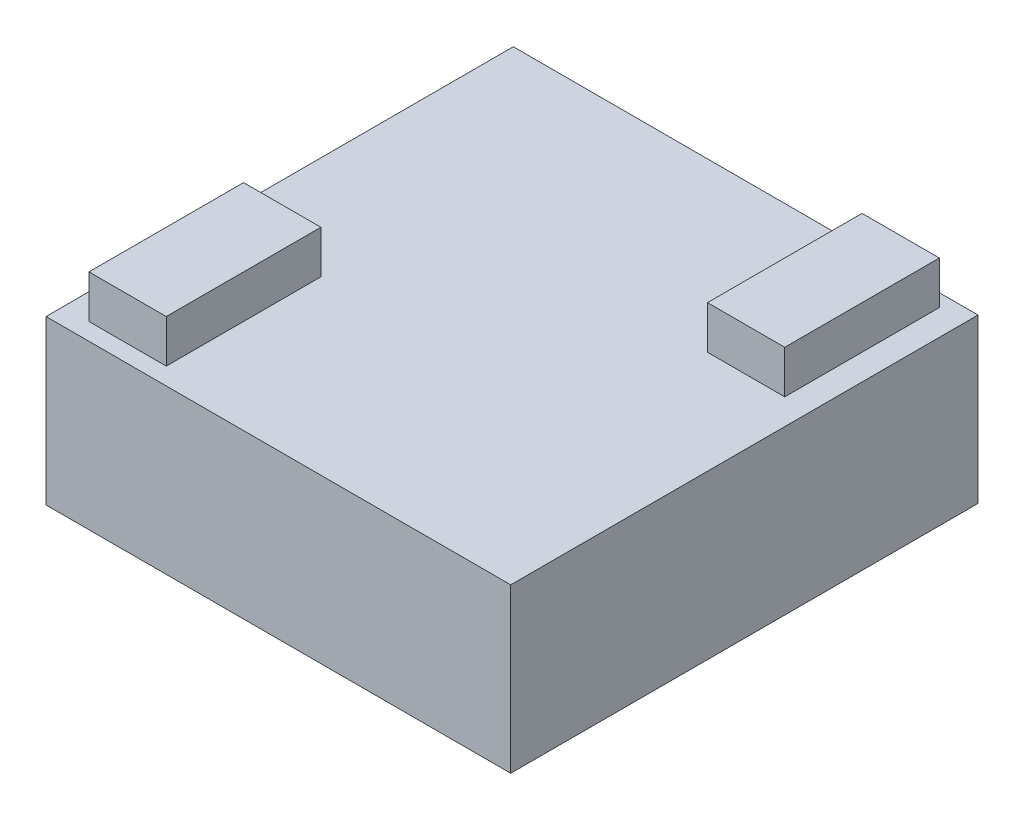
ISO-10303-21;
HEADER;
FILE_DESCRIPTION(('STEP AP214'),'2;1');
FILE_NAME('part.step','',(''),(''),'','','');
FILE_SCHEMA(('AUTOMOTIVE_DESIGN { 1 0 10303 214 1 1 1 1 }'));
ENDSEC;
DATA;
#1=APPLICATION_CONTEXT('core data for automotive mechanical design processes');
#2=APPLICATION_PROTOCOL_DEFINITION('international standard','automotive_design',2000,#1);
#3=PRODUCT_CONTEXT('',#1,'mechanical');
#4=PRODUCT('Part','Part','',(#3));
#5=PRODUCT_RELATED_PRODUCT_CATEGORY('part','',(#4));
#6=PRODUCT_DEFINITION_FORMATION('','',#4);
#7=PRODUCT_DEFINITION_CONTEXT('part definition',#1,'design');
#8=PRODUCT_DEFINITION('design','',#6,#7);
#9=PRODUCT_DEFINITION_SHAPE('','',#8);
#10=(LENGTH_UNIT() NAMED_UNIT(*) SI_UNIT(.MILLI.,.METRE.));
#11=(NAMED_UNIT(*) PLANE_ANGLE_UNIT() SI_UNIT($,.RADIAN.));
#12=(NAMED_UNIT(*) SI_UNIT($,.STERADIAN.) SOLID_ANGLE_UNIT());
#13=UNCERTAINTY_MEASURE_WITH_UNIT(LENGTH_MEASURE(1.E-05),#10,'distance_accuracy_value','');
#14=(GEOMETRIC_REPRESENTATION_CONTEXT(3) GLOBAL_UNCERTAINTY_ASSIGNED_CONTEXT((#13)) GLOBAL_UNIT_ASSIGNED_CONTEXT((#10,
#11,#12)) REPRESENTATION_CONTEXT('',''));
#15=CARTESIAN_POINT('',(0.,0.,0.));
#16=DIRECTION('',(0.,0.,1.));
#17=DIRECTION('',(1.,0.,0.));
#18=AXIS2_PLACEMENT_3D('',#15,#16,#17);
#19=CARTESIAN_POINT('',(0.,19.,0.));
#20=DIRECTION('',(0.,-1.,0.));
#21=DIRECTION('',(0.,0.,-1.));
#22=AXIS2_PLACEMENT_3D('',#19,#20,#21);
#23=PLANE('',#22);
#24=DIRECTION('',(0.,0.,1.));
#25=VECTOR('',#24,1.);
#26=CARTESIAN_POINT('',(42.1,19.,-52.9));
#27=LINE('',#26,#25);
#28=CARTESIAN_POINT('',(42.1,19.,-52.9));
#29=VERTEX_POINT('',#28);
#30=CARTESIAN_POINT('',(42.1,19.,-34.9));
#31=VERTEX_POINT('',#30);
#32=EDGE_CURVE('E168',#29,#31,#27,.T.);
#33=ORIENTED_EDGE('',*,*,#32,.F.);
#34=DIRECTION('',(-1.,0.,0.));
#35=VECTOR('',#34,1.);
#36=CARTESIAN_POINT('',(42.1,19.,-52.9));
#37=LINE('',#36,#35);
#38=CARTESIAN_POINT('',(51.1,19.,-52.9));
#39=VERTEX_POINT('',#38);
#40=EDGE_CURVE('E181',#39,#29,#37,.T.);
#41=ORIENTED_EDGE('',*,*,#40,.F.);
#42=DIRECTION('',(0.,0.,-1.));
#43=VECTOR('',#42,1.);
#44=CARTESIAN_POINT('',(51.1,19.,-52.9));
#45=LINE('',#44,#43);
#46=CARTESIAN_POINT('',(51.1,19.,-34.9));
#47=VERTEX_POINT('',#46);
#48=EDGE_CURVE('E190',#47,#39,#45,.T.);
#49=ORIENTED_EDGE('',*,*,#48,.F.);
#50=DIRECTION('',(1.,0.,0.));
#51=VECTOR('',#50,1.);
#52=CARTESIAN_POINT('',(42.1,19.,-34.9));
#53=LINE('',#52,#51);
#54=EDGE_CURVE('E171',#31,#47,#53,.T.);
#55=ORIENTED_EDGE('',*,*,#54,.F.);
#56=EDGE_LOOP('',(#33,#41,#49,#55));
#57=FACE_BOUND('',#56,.T.);
#58=DIRECTION('',(0.,0.,1.));
#59=VECTOR('',#58,1.);
#60=CARTESIAN_POINT('',(0.,19.,0.));
#61=LINE('',#60,#59);
#62=CARTESIAN_POINT('',(0.,19.,-54.4));
#63=VERTEX_POINT('',#62);
#64=CARTESIAN_POINT('',(0.,19.,0.));
#65=VERTEX_POINT('',#64);
#66=EDGE_CURVE('E236',#63,#65,#61,.T.);
#67=ORIENTED_EDGE('',*,*,#66,.T.);
#68=DIRECTION('',(1.,0.,0.));
#69=VECTOR('',#68,1.);
#70=CARTESIAN_POINT('',(0.,19.,0.));
#71=LINE('',#70,#69);
#72=CARTESIAN_POINT('',(54.1,19.,0.));
#73=VERTEX_POINT('',#72);
#74=EDGE_CURVE('E239',#65,#73,#71,.T.);
#75=ORIENTED_EDGE('',*,*,#74,.T.);
#76=DIRECTION('',(0.,0.,-1.));
#77=VECTOR('',#76,1.);
#78=CARTESIAN_POINT('',(54.1,19.,0.));
#79=LINE('',#78,#77);
#80=CARTESIAN_POINT('',(54.1,19.,-54.4));
#81=VERTEX_POINT('',#80);
#82=EDGE_CURVE('E242',#73,#81,#79,.T.);
#83=ORIENTED_EDGE('',*,*,#82,.T.);
#84=DIRECTION('',(-1.,0.,0.));
#85=VECTOR('',#84,1.);
#86=CARTESIAN_POINT('',(0.,19.,-54.4));
#87=LINE('',#86,#85);
#88=EDGE_CURVE('E244',#81,#63,#87,.T.);
#89=ORIENTED_EDGE('',*,*,#88,.T.);
#90=EDGE_LOOP('',(#67,#75,#83,#89));
#91=FACE_BOUND('',#90,.T.);
#92=DIRECTION('',(0.,0.,1.));
#93=VECTOR('',#92,1.);
#94=CARTESIAN_POINT('',(3.,19.,-20.));
#95=LINE('',#94,#93);
#96=CARTESIAN_POINT('',(3.,19.,-20.));
#97=VERTEX_POINT('',#96);
#98=CARTESIAN_POINT('',(3.,19.,-2.));
#99=VERTEX_POINT('',#98);
#100=EDGE_CURVE('E167',#97,#99,#95,.T.);
#101=ORIENTED_EDGE('',*,*,#100,.F.);
#102=DIRECTION('',(-1.,0.,0.));
#103=VECTOR('',#102,1.);
#104=CARTESIAN_POINT('',(3.,19.,-20.));
#105=LINE('',#104,#103);
#106=CARTESIAN_POINT('',(12.,19.,-20.));
#107=VERTEX_POINT('',#106);
#108=EDGE_CURVE('E164',#107,#97,#105,.T.);
#109=ORIENTED_EDGE('',*,*,#108,.F.);
#110=DIRECTION('',(0.,0.,-1.));
#111=VECTOR('',#110,1.);
#112=CARTESIAN_POINT('',(12.,19.,-20.));
#113=LINE('',#112,#111);
#114=CARTESIAN_POINT('',(12.,19.,-2.));
#115=VERTEX_POINT('',#114);
#116=EDGE_CURVE('E54',#115,#107,#113,.T.);
#117=ORIENTED_EDGE('',*,*,#116,.F.);
#118=DIRECTION('',(1.,0.,0.));
#119=VECTOR('',#118,1.);
#120=CARTESIAN_POINT('',(3.,19.,-2.));
#121=LINE('',#120,#119);
#122=EDGE_CURVE('E49',#99,#115,#121,.T.);
#123=ORIENTED_EDGE('',*,*,#122,.F.);
#124=EDGE_LOOP('',(#101,#109,#117,#123));
#125=FACE_BOUND('',#124,.T.);
#126=ADVANCED_FACE('F34',(#57,#91,#125),#23,.F.);
#127=CARTESIAN_POINT('',(0.,0.,0.));
#128=DIRECTION('',(0.,-1.,0.));
#129=DIRECTION('',(0.,0.,-1.));
#130=AXIS2_PLACEMENT_3D('',#127,#128,#129);
#131=PLANE('',#130);
#132=DIRECTION('',(0.,0.,1.));
#133=VECTOR('',#132,1.);
#134=CARTESIAN_POINT('',(0.,0.,0.));
#135=LINE('',#134,#133);
#136=CARTESIAN_POINT('',(0.,0.,-54.4));
#137=VERTEX_POINT('',#136);
#138=CARTESIAN_POINT('',(0.,0.,0.));
#139=VERTEX_POINT('',#138);
#140=EDGE_CURVE('E235',#137,#139,#135,.T.);
#141=ORIENTED_EDGE('',*,*,#140,.F.);
#142=DIRECTION('',(-1.,0.,0.));
#143=VECTOR('',#142,1.);
#144=CARTESIAN_POINT('',(0.,0.,-54.4));
#145=LINE('',#144,#143);
#146=CARTESIAN_POINT('',(54.1,0.,-54.4));
#147=VERTEX_POINT('',#146);
#148=EDGE_CURVE('E240',#147,#137,#145,.T.);
#149=ORIENTED_EDGE('',*,*,#148,.F.);
#150=DIRECTION('',(0.,0.,-1.));
#151=VECTOR('',#150,1.);
#152=CARTESIAN_POINT('',(54.1,0.,0.));
#153=LINE('',#152,#151);
#154=CARTESIAN_POINT('',(54.1,0.,0.));
#155=VERTEX_POINT('',#154);
#156=EDGE_CURVE('E251',#155,#147,#153,.T.);
#157=ORIENTED_EDGE('',*,*,#156,.F.);
#158=DIRECTION('',(1.,0.,0.));
#159=VECTOR('',#158,1.);
#160=CARTESIAN_POINT('',(0.,0.,0.));
#161=LINE('',#160,#159);
#162=EDGE_CURVE('E249',#139,#155,#161,.T.);
#163=ORIENTED_EDGE('',*,*,#162,.F.);
#164=EDGE_LOOP('',(#141,#149,#157,#163));
#165=FACE_BOUND('',#164,.T.);
#166=DIRECTION('',(1.,0.,0.));
#167=VECTOR('',#166,1.);
#168=CARTESIAN_POINT('',(17.,0.,-34.4));
#169=LINE('',#168,#167);
#170=CARTESIAN_POINT('',(17.,0.,-34.4));
#171=VERTEX_POINT('',#170);
#172=CARTESIAN_POINT('',(37.,0.,-34.4));
#173=VERTEX_POINT('',#172);
#174=EDGE_CURVE('E220',#171,#173,#169,.T.);
#175=ORIENTED_EDGE('',*,*,#174,.F.);
#176=DIRECTION('',(0.,0.,-1.));
#177=VECTOR('',#176,1.);
#178=CARTESIAN_POINT('',(17.,0.,-34.4));
#179=LINE('',#178,#177);
#180=CARTESIAN_POINT('',(17.,0.,-22.4));
#181=VERTEX_POINT('',#180);
#182=EDGE_CURVE('E206',#181,#171,#179,.T.);
#183=ORIENTED_EDGE('',*,*,#182,.F.);
#184=DIRECTION('',(-1.,0.,0.));
#185=VECTOR('',#184,1.);
#186=CARTESIAN_POINT('',(17.,0.,-22.4));
#187=LINE('',#186,#185);
#188=CARTESIAN_POINT('',(37.,0.,-22.4));
#189=VERTEX_POINT('',#188);
#190=EDGE_CURVE('E211',#189,#181,#187,.T.);
#191=ORIENTED_EDGE('',*,*,#190,.F.);
#192=DIRECTION('',(0.,0.,1.));
#193=VECTOR('',#192,1.);
#194=CARTESIAN_POINT('',(37.,0.,-34.4));
#195=LINE('',#194,#193);
#196=EDGE_CURVE('E222',#173,#189,#195,.T.);
#197=ORIENTED_EDGE('',*,*,#196,.F.);
#198=EDGE_LOOP('',(#175,#183,#191,#197));
#199=FACE_BOUND('',#198,.T.);
#200=ADVANCED_FACE('F269',(#165,#199),#131,.T.);
#201=CARTESIAN_POINT('',(0.,19.,0.));
#202=DIRECTION('',(1.,0.,0.));
#203=DIRECTION('',(0.,0.,-1.));
#204=AXIS2_PLACEMENT_3D('',#201,#202,#203);
#205=PLANE('',#204);
#206=ORIENTED_EDGE('',*,*,#140,.T.);
#207=DIRECTION('',(0.,-1.,0.));
#208=VECTOR('',#207,1.);
#209=CARTESIAN_POINT('',(0.,19.,0.));
#210=LINE('',#209,#208);
#211=EDGE_CURVE('E11',#65,#139,#210,.T.);
#212=ORIENTED_EDGE('',*,*,#211,.F.);
#213=ORIENTED_EDGE('',*,*,#66,.F.);
#214=DIRECTION('',(0.,-1.,0.));
#215=VECTOR('',#214,1.);
#216=CARTESIAN_POINT('',(0.,19.,-54.4));
#217=LINE('',#216,#215);
#218=EDGE_CURVE('E246',#63,#137,#217,.T.);
#219=ORIENTED_EDGE('',*,*,#218,.T.);
#220=EDGE_LOOP('',(#206,#212,#213,#219));
#221=FACE_BOUND('',#220,.T.);
#222=ADVANCED_FACE('F36',(#221),#205,.F.);
#223=CARTESIAN_POINT('',(0.,19.,0.));
#224=DIRECTION('',(0.,0.,-1.));
#225=DIRECTION('',(-1.,0.,0.));
#226=AXIS2_PLACEMENT_3D('',#223,#224,#225);
#227=PLANE('',#226);
#228=ORIENTED_EDGE('',*,*,#162,.T.);
#229=DIRECTION('',(0.,-1.,0.));
#230=VECTOR('',#229,1.);
#231=CARTESIAN_POINT('',(54.1,19.,0.));
#232=LINE('',#231,#230);
#233=EDGE_CURVE('E42',#73,#155,#232,.T.);
#234=ORIENTED_EDGE('',*,*,#233,.F.);
#235=ORIENTED_EDGE('',*,*,#74,.F.);
#236=ORIENTED_EDGE('',*,*,#211,.T.);
#237=EDGE_LOOP('',(#228,#234,#235,#236));
#238=FACE_BOUND('',#237,.T.);
#239=ADVANCED_FACE('F279',(#238),#227,.F.);
#240=CARTESIAN_POINT('',(54.1,19.,0.));
#241=DIRECTION('',(-1.,0.,0.));
#242=DIRECTION('',(0.,0.,1.));
#243=AXIS2_PLACEMENT_3D('',#240,#241,#242);
#244=PLANE('',#243);
#245=ORIENTED_EDGE('',*,*,#156,.T.);
#246=DIRECTION('',(0.,-1.,0.));
#247=VECTOR('',#246,1.);
#248=CARTESIAN_POINT('',(54.1,19.,-54.4));
#249=LINE('',#248,#247);
#250=EDGE_CURVE('E256',#81,#147,#249,.T.);
#251=ORIENTED_EDGE('',*,*,#250,.F.);
#252=ORIENTED_EDGE('',*,*,#82,.F.);
#253=ORIENTED_EDGE('',*,*,#233,.T.);
#254=EDGE_LOOP('',(#245,#251,#252,#253));
#255=FACE_BOUND('',#254,.T.);
#256=ADVANCED_FACE('F263',(#255),#244,.F.);
#257=CARTESIAN_POINT('',(0.,19.,-54.4));
#258=DIRECTION('',(0.,0.,1.));
#259=DIRECTION('',(1.,0.,0.));
#260=AXIS2_PLACEMENT_3D('',#257,#258,#259);
#261=PLANE('',#260);
#262=ORIENTED_EDGE('',*,*,#148,.T.);
#263=ORIENTED_EDGE('',*,*,#218,.F.);
#264=ORIENTED_EDGE('',*,*,#88,.F.);
#265=ORIENTED_EDGE('',*,*,#250,.T.);
#266=EDGE_LOOP('',(#262,#263,#264,#265));
#267=FACE_BOUND('',#266,.T.);
#268=ADVANCED_FACE('F273',(#267),#261,.F.);
#269=CARTESIAN_POINT('',(17.,-15.,-34.4));
#270=DIRECTION('',(1.,0.,0.));
#271=DIRECTION('',(0.,0.,-1.));
#272=AXIS2_PLACEMENT_3D('',#269,#270,#271);
#273=PLANE('',#272);
#274=ORIENTED_EDGE('',*,*,#182,.T.);
#275=DIRECTION('',(0.,1.,0.));
#276=VECTOR('',#275,1.);
#277=CARTESIAN_POINT('',(17.,-15.,-34.4));
#278=LINE('',#277,#276);
#279=CARTESIAN_POINT('',(17.,-15.,-34.4));
#280=VERTEX_POINT('',#279);
#281=EDGE_CURVE('E233',#280,#171,#278,.T.);
#282=ORIENTED_EDGE('',*,*,#281,.F.);
#283=DIRECTION('',(0.,0.,-1.));
#284=VECTOR('',#283,1.);
#285=CARTESIAN_POINT('',(17.,-15.,-34.4));
#286=LINE('',#285,#284);
#287=CARTESIAN_POINT('',(17.,-15.,-22.4));
#288=VERTEX_POINT('',#287);
#289=EDGE_CURVE('E207',#288,#280,#286,.T.);
#290=ORIENTED_EDGE('',*,*,#289,.F.);
#291=DIRECTION('',(0.,1.,0.));
#292=VECTOR('',#291,1.);
#293=CARTESIAN_POINT('',(17.,-15.,-22.4));
#294=LINE('',#293,#292);
#295=EDGE_CURVE('E217',#288,#181,#294,.T.);
#296=ORIENTED_EDGE('',*,*,#295,.T.);
#297=EDGE_LOOP('',(#274,#282,#290,#296));
#298=FACE_BOUND('',#297,.T.);
#299=ADVANCED_FACE('F294',(#298),#273,.F.);
#300=CARTESIAN_POINT('',(17.,-15.,-34.4));
#301=DIRECTION('',(0.,0.,1.));
#302=DIRECTION('',(1.,0.,0.));
#303=AXIS2_PLACEMENT_3D('',#300,#301,#302);
#304=PLANE('',#303);
#305=ORIENTED_EDGE('',*,*,#174,.T.);
#306=DIRECTION('',(0.,1.,0.));
#307=VECTOR('',#306,1.);
#308=CARTESIAN_POINT('',(37.,-15.,-34.4));
#309=LINE('',#308,#307);
#310=CARTESIAN_POINT('',(37.,-15.,-34.4));
#311=VERTEX_POINT('',#310);
#312=EDGE_CURVE('E230',#311,#173,#309,.T.);
#313=ORIENTED_EDGE('',*,*,#312,.F.);
#314=DIRECTION('',(1.,0.,0.));
#315=VECTOR('',#314,1.);
#316=CARTESIAN_POINT('',(17.,-15.,-34.4));
#317=LINE('',#316,#315);
#318=EDGE_CURVE('E210',#280,#311,#317,.T.);
#319=ORIENTED_EDGE('',*,*,#318,.F.);
#320=ORIENTED_EDGE('',*,*,#281,.T.);
#321=EDGE_LOOP('',(#305,#313,#319,#320));
#322=FACE_BOUND('',#321,.T.);
#323=ADVANCED_FACE('F301',(#322),#304,.F.);
#324=CARTESIAN_POINT('',(37.,-15.,-34.4));
#325=DIRECTION('',(-1.,0.,0.));
#326=DIRECTION('',(0.,0.,1.));
#327=AXIS2_PLACEMENT_3D('',#324,#325,#326);
#328=PLANE('',#327);
#329=ORIENTED_EDGE('',*,*,#196,.T.);
#330=DIRECTION('',(0.,1.,0.));
#331=VECTOR('',#330,1.);
#332=CARTESIAN_POINT('',(37.,-15.,-22.4));
#333=LINE('',#332,#331);
#334=CARTESIAN_POINT('',(37.,-15.,-22.4));
#335=VERTEX_POINT('',#334);
#336=EDGE_CURVE('E228',#335,#189,#333,.T.);
#337=ORIENTED_EDGE('',*,*,#336,.F.);
#338=DIRECTION('',(0.,0.,1.));
#339=VECTOR('',#338,1.);
#340=CARTESIAN_POINT('',(37.,-15.,-34.4));
#341=LINE('',#340,#339);
#342=EDGE_CURVE('E213',#311,#335,#341,.T.);
#343=ORIENTED_EDGE('',*,*,#342,.F.);
#344=ORIENTED_EDGE('',*,*,#312,.T.);
#345=EDGE_LOOP('',(#329,#337,#343,#344));
#346=FACE_BOUND('',#345,.T.);
#347=ADVANCED_FACE('F306',(#346),#328,.F.);
#348=CARTESIAN_POINT('',(17.,-15.,-22.4));
#349=DIRECTION('',(0.,0.,-1.));
#350=DIRECTION('',(-1.,0.,0.));
#351=AXIS2_PLACEMENT_3D('',#348,#349,#350);
#352=PLANE('',#351);
#353=ORIENTED_EDGE('',*,*,#190,.T.);
#354=ORIENTED_EDGE('',*,*,#295,.F.);
#355=DIRECTION('',(-1.,0.,0.));
#356=VECTOR('',#355,1.);
#357=CARTESIAN_POINT('',(17.,-15.,-22.4));
#358=LINE('',#357,#356);
#359=EDGE_CURVE('E215',#335,#288,#358,.T.);
#360=ORIENTED_EDGE('',*,*,#359,.F.);
#361=ORIENTED_EDGE('',*,*,#336,.T.);
#362=EDGE_LOOP('',(#353,#354,#360,#361));
#363=FACE_BOUND('',#362,.T.);
#364=ADVANCED_FACE('F323',(#363),#352,.F.);
#365=CARTESIAN_POINT('',(0.,-15.,0.));
#366=DIRECTION('',(0.,1.,0.));
#367=DIRECTION('',(0.,0.,1.));
#368=AXIS2_PLACEMENT_3D('',#365,#366,#367);
#369=PLANE('',#368);
#370=ORIENTED_EDGE('',*,*,#289,.T.);
#371=ORIENTED_EDGE('',*,*,#318,.T.);
#372=ORIENTED_EDGE('',*,*,#342,.T.);
#373=ORIENTED_EDGE('',*,*,#359,.T.);
#374=EDGE_LOOP('',(#370,#371,#372,#373));
#375=FACE_BOUND('',#374,.T.);
#376=ADVANCED_FACE('F321',(#375),#369,.F.);
#377=CARTESIAN_POINT('',(42.1,24.,-52.9));
#378=DIRECTION('',(1.,0.,0.));
#379=DIRECTION('',(0.,0.,-1.));
#380=AXIS2_PLACEMENT_3D('',#377,#378,#379);
#381=PLANE('',#380);
#382=ORIENTED_EDGE('',*,*,#32,.T.);
#383=DIRECTION('',(0.,-1.,0.));
#384=VECTOR('',#383,1.);
#385=CARTESIAN_POINT('',(42.1,24.,-34.9));
#386=LINE('',#385,#384);
#387=CARTESIAN_POINT('',(42.1,24.,-34.9));
#388=VERTEX_POINT('',#387);
#389=EDGE_CURVE('E203',#388,#31,#386,.T.);
#390=ORIENTED_EDGE('',*,*,#389,.F.);
#391=DIRECTION('',(0.,0.,1.));
#392=VECTOR('',#391,1.);
#393=CARTESIAN_POINT('',(42.1,24.,-52.9));
#394=LINE('',#393,#392);
#395=CARTESIAN_POINT('',(42.1,24.,-52.9));
#396=VERTEX_POINT('',#395);
#397=EDGE_CURVE('E177',#396,#388,#394,.T.);
#398=ORIENTED_EDGE('',*,*,#397,.F.);
#399=DIRECTION('',(0.,-1.,0.));
#400=VECTOR('',#399,1.);
#401=CARTESIAN_POINT('',(42.1,24.,-52.9));
#402=LINE('',#401,#400);
#403=EDGE_CURVE('E186',#396,#29,#402,.T.);
#404=ORIENTED_EDGE('',*,*,#403,.T.);
#405=EDGE_LOOP('',(#382,#390,#398,#404));
#406=FACE_BOUND('',#405,.T.);
#407=ADVANCED_FACE('F330',(#406),#381,.F.);
#408=CARTESIAN_POINT('',(42.1,24.,-34.9));
#409=DIRECTION('',(0.,0.,-1.));
#410=DIRECTION('',(-1.,0.,0.));
#411=AXIS2_PLACEMENT_3D('',#408,#409,#410);
#412=PLANE('',#411);
#413=ORIENTED_EDGE('',*,*,#54,.T.);
#414=DIRECTION('',(0.,-1.,0.));
#415=VECTOR('',#414,1.);
#416=CARTESIAN_POINT('',(51.1,24.,-34.9));
#417=LINE('',#416,#415);
#418=CARTESIAN_POINT('',(51.1,24.,-34.9));
#419=VERTEX_POINT('',#418);
#420=EDGE_CURVE('E200',#419,#47,#417,.T.);
#421=ORIENTED_EDGE('',*,*,#420,.F.);
#422=DIRECTION('',(1.,0.,0.));
#423=VECTOR('',#422,1.);
#424=CARTESIAN_POINT('',(42.1,24.,-34.9));
#425=LINE('',#424,#423);
#426=EDGE_CURVE('E180',#388,#419,#425,.T.);
#427=ORIENTED_EDGE('',*,*,#426,.F.);
#428=ORIENTED_EDGE('',*,*,#389,.T.);
#429=EDGE_LOOP('',(#413,#421,#427,#428));
#430=FACE_BOUND('',#429,.T.);
#431=ADVANCED_FACE('F336',(#430),#412,.F.);
#432=CARTESIAN_POINT('',(51.1,24.,-52.9));
#433=DIRECTION('',(-1.,0.,0.));
#434=DIRECTION('',(0.,0.,1.));
#435=AXIS2_PLACEMENT_3D('',#432,#433,#434);
#436=PLANE('',#435);
#437=ORIENTED_EDGE('',*,*,#48,.T.);
#438=DIRECTION('',(0.,-1.,0.));
#439=VECTOR('',#438,1.);
#440=CARTESIAN_POINT('',(51.1,24.,-52.9));
#441=LINE('',#440,#439);
#442=CARTESIAN_POINT('',(51.1,24.,-52.9));
#443=VERTEX_POINT('',#442);
#444=EDGE_CURVE('E197',#443,#39,#441,.T.);
#445=ORIENTED_EDGE('',*,*,#444,.F.);
#446=DIRECTION('',(0.,0.,-1.));
#447=VECTOR('',#446,1.);
#448=CARTESIAN_POINT('',(51.1,24.,-52.9));
#449=LINE('',#448,#447);
#450=EDGE_CURVE('E183',#419,#443,#449,.T.);
#451=ORIENTED_EDGE('',*,*,#450,.F.);
#452=ORIENTED_EDGE('',*,*,#420,.T.);
#453=EDGE_LOOP('',(#437,#445,#451,#452));
#454=FACE_BOUND('',#453,.T.);
#455=ADVANCED_FACE('F340',(#454),#436,.F.);
#456=CARTESIAN_POINT('',(42.1,24.,-52.9));
#457=DIRECTION('',(0.,0.,1.));
#458=DIRECTION('',(1.,0.,0.));
#459=AXIS2_PLACEMENT_3D('',#456,#457,#458);
#460=PLANE('',#459);
#461=ORIENTED_EDGE('',*,*,#40,.T.);
#462=ORIENTED_EDGE('',*,*,#403,.F.);
#463=DIRECTION('',(-1.,0.,0.));
#464=VECTOR('',#463,1.);
#465=CARTESIAN_POINT('',(42.1,24.,-52.9));
#466=LINE('',#465,#464);
#467=EDGE_CURVE('E185',#443,#396,#466,.T.);
#468=ORIENTED_EDGE('',*,*,#467,.F.);
#469=ORIENTED_EDGE('',*,*,#444,.T.);
#470=EDGE_LOOP('',(#461,#462,#468,#469));
#471=FACE_BOUND('',#470,.T.);
#472=ADVANCED_FACE('F344',(#471),#460,.F.);
#473=CARTESIAN_POINT('',(0.,24.,0.));
#474=DIRECTION('',(0.,1.,0.));
#475=DIRECTION('',(0.,0.,1.));
#476=AXIS2_PLACEMENT_3D('',#473,#474,#475);
#477=PLANE('',#476);
#478=ORIENTED_EDGE('',*,*,#397,.T.);
#479=ORIENTED_EDGE('',*,*,#426,.T.);
#480=ORIENTED_EDGE('',*,*,#450,.T.);
#481=ORIENTED_EDGE('',*,*,#467,.T.);
#482=EDGE_LOOP('',(#478,#479,#480,#481));
#483=FACE_BOUND('',#482,.T.);
#484=ADVANCED_FACE('F348',(#483),#477,.T.);
#485=CARTESIAN_POINT('',(3.,24.,-20.));
#486=DIRECTION('',(1.,0.,0.));
#487=DIRECTION('',(0.,0.,-1.));
#488=AXIS2_PLACEMENT_3D('',#485,#486,#487);
#489=PLANE('',#488);
#490=ORIENTED_EDGE('',*,*,#100,.T.);
#491=DIRECTION('',(0.,-1.,0.));
#492=VECTOR('',#491,1.);
#493=CARTESIAN_POINT('',(3.,24.,-2.));
#494=LINE('',#493,#492);
#495=CARTESIAN_POINT('',(3.,24.,-2.));
#496=VERTEX_POINT('',#495);
#497=EDGE_CURVE('E148',#496,#99,#494,.T.);
#498=ORIENTED_EDGE('',*,*,#497,.F.);
#499=DIRECTION('',(0.,0.,1.));
#500=VECTOR('',#499,1.);
#501=CARTESIAN_POINT('',(3.,24.,-20.));
#502=LINE('',#501,#500);
#503=CARTESIAN_POINT('',(3.,24.,-20.));
#504=VERTEX_POINT('',#503);
#505=EDGE_CURVE('E155',#504,#496,#502,.T.);
#506=ORIENTED_EDGE('',*,*,#505,.F.);
#507=DIRECTION('',(0.,-1.,0.));
#508=VECTOR('',#507,1.);
#509=CARTESIAN_POINT('',(3.,24.,-20.));
#510=LINE('',#509,#508);
#511=EDGE_CURVE('E486',#504,#97,#510,.T.);
#512=ORIENTED_EDGE('',*,*,#511,.T.);
#513=EDGE_LOOP('',(#490,#498,#506,#512));
#514=FACE_BOUND('',#513,.T.);
#515=ADVANCED_FACE('F166',(#514),#489,.F.);
#516=CARTESIAN_POINT('',(3.,24.,-2.));
#517=DIRECTION('',(0.,0.,-1.));
#518=DIRECTION('',(-1.,0.,0.));
#519=AXIS2_PLACEMENT_3D('',#516,#517,#518);
#520=PLANE('',#519);
#521=ORIENTED_EDGE('',*,*,#122,.T.);
#522=DIRECTION('',(0.,-1.,0.));
#523=VECTOR('',#522,1.);
#524=CARTESIAN_POINT('',(12.,24.,-2.));
#525=LINE('',#524,#523);
#526=CARTESIAN_POINT('',(12.,24.,-2.));
#527=VERTEX_POINT('',#526);
#528=EDGE_CURVE('E151',#527,#115,#525,.T.);
#529=ORIENTED_EDGE('',*,*,#528,.F.);
#530=DIRECTION('',(1.,0.,0.));
#531=VECTOR('',#530,1.);
#532=CARTESIAN_POINT('',(3.,24.,-2.));
#533=LINE('',#532,#531);
#534=EDGE_CURVE('E144',#496,#527,#533,.T.);
#535=ORIENTED_EDGE('',*,*,#534,.F.);
#536=ORIENTED_EDGE('',*,*,#497,.T.);
#537=EDGE_LOOP('',(#521,#529,#535,#536));
#538=FACE_BOUND('',#537,.T.);
#539=ADVANCED_FACE('F146',(#538),#520,.F.);
#540=CARTESIAN_POINT('',(12.,24.,-20.));
#541=DIRECTION('',(-1.,0.,0.));
#542=DIRECTION('',(0.,0.,1.));
#543=AXIS2_PLACEMENT_3D('',#540,#541,#542);
#544=PLANE('',#543);
#545=ORIENTED_EDGE('',*,*,#116,.T.);
#546=DIRECTION('',(0.,-1.,0.));
#547=VECTOR('',#546,1.);
#548=CARTESIAN_POINT('',(12.,24.,-20.));
#549=LINE('',#548,#547);
#550=CARTESIAN_POINT('',(12.,24.,-20.));
#551=VERTEX_POINT('',#550);
#552=EDGE_CURVE('E173',#551,#107,#549,.T.);
#553=ORIENTED_EDGE('',*,*,#552,.F.);
#554=DIRECTION('',(0.,0.,-1.));
#555=VECTOR('',#554,1.);
#556=CARTESIAN_POINT('',(12.,24.,-20.));
#557=LINE('',#556,#555);
#558=EDGE_CURVE('E154',#527,#551,#557,.T.);
#559=ORIENTED_EDGE('',*,*,#558,.F.);
#560=ORIENTED_EDGE('',*,*,#528,.T.);
#561=EDGE_LOOP('',(#545,#553,#559,#560));
#562=FACE_BOUND('',#561,.T.);
#563=ADVANCED_FACE('F357',(#562),#544,.F.);
#564=CARTESIAN_POINT('',(3.,24.,-20.));
#565=DIRECTION('',(0.,0.,1.));
#566=DIRECTION('',(1.,0.,0.));
#567=AXIS2_PLACEMENT_3D('',#564,#565,#566);
#568=PLANE('',#567);
#569=ORIENTED_EDGE('',*,*,#108,.T.);
#570=ORIENTED_EDGE('',*,*,#511,.F.);
#571=DIRECTION('',(-1.,0.,0.));
#572=VECTOR('',#571,1.);
#573=CARTESIAN_POINT('',(3.,24.,-20.));
#574=LINE('',#573,#572);
#575=EDGE_CURVE('E160',#551,#504,#574,.T.);
#576=ORIENTED_EDGE('',*,*,#575,.F.);
#577=ORIENTED_EDGE('',*,*,#552,.T.);
#578=EDGE_LOOP('',(#569,#570,#576,#577));
#579=FACE_BOUND('',#578,.T.);
#580=ADVANCED_FACE('F360',(#579),#568,.F.);
#581=CARTESIAN_POINT('',(0.,24.,0.));
#582=DIRECTION('',(0.,1.,0.));
#583=DIRECTION('',(0.,0.,1.));
#584=AXIS2_PLACEMENT_3D('',#581,#582,#583);
#585=PLANE('',#584);
#586=ORIENTED_EDGE('',*,*,#505,.T.);
#587=ORIENTED_EDGE('',*,*,#534,.T.);
#588=ORIENTED_EDGE('',*,*,#558,.T.);
#589=ORIENTED_EDGE('',*,*,#575,.T.);
#590=EDGE_LOOP('',(#586,#587,#588,#589));
#591=FACE_BOUND('',#590,.T.);
#592=ADVANCED_FACE('F158',(#591),#585,.T.);
#593=CLOSED_SHELL('',(#126,#200,#222,#239,#256,#268,#299,#323,#347,#364,#376,#407,#431,#455,
#472,#484,#515,#539,#563,#580,#592));
#594=MANIFOLD_SOLID_BREP('B2',#593);
#595=ADVANCED_BREP_SHAPE_REPRESENTATION('',(#18,#594),#14);
#596=SHAPE_DEFINITION_REPRESENTATION(#9,#595);
ENDSEC;
END-ISO-10303-21;
